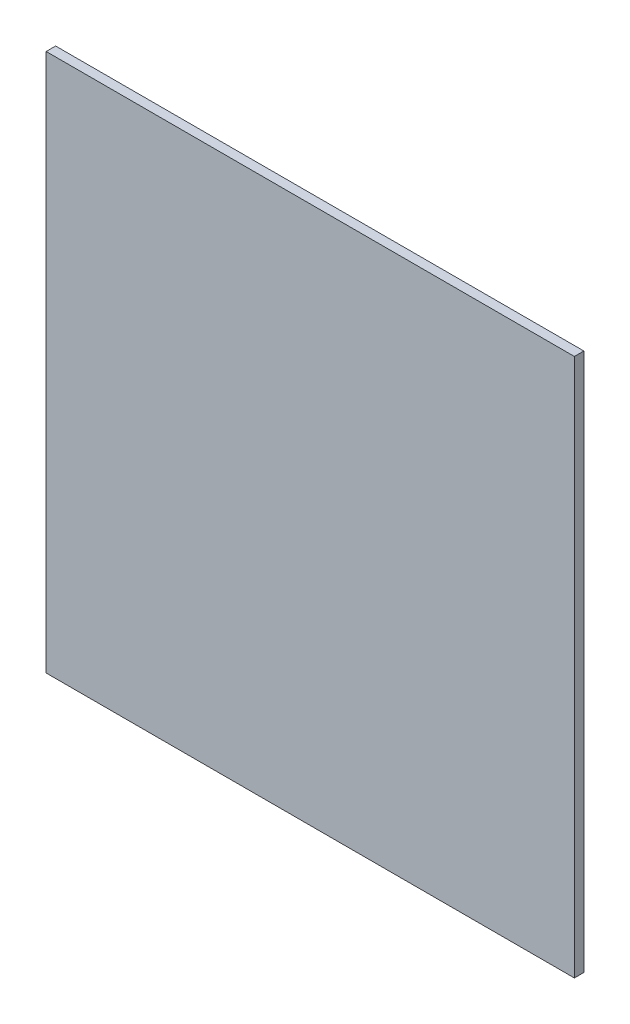
ISO-10303-21;
HEADER;
FILE_DESCRIPTION(('STEP AP214'),'2;1');
FILE_NAME('part.step','',(''),(''),'','','');
FILE_SCHEMA(('AUTOMOTIVE_DESIGN { 1 0 10303 214 1 1 1 1 }'));
ENDSEC;
DATA;
#1=APPLICATION_CONTEXT('core data for automotive mechanical design processes');
#2=APPLICATION_PROTOCOL_DEFINITION('international standard','automotive_design',2000,#1);
#3=PRODUCT_CONTEXT('',#1,'mechanical');
#4=PRODUCT('Part','Part','',(#3));
#5=PRODUCT_RELATED_PRODUCT_CATEGORY('part','',(#4));
#6=PRODUCT_DEFINITION_FORMATION('','',#4);
#7=PRODUCT_DEFINITION_CONTEXT('part definition',#1,'design');
#8=PRODUCT_DEFINITION('design','',#6,#7);
#9=PRODUCT_DEFINITION_SHAPE('','',#8);
#10=(LENGTH_UNIT() NAMED_UNIT(*) SI_UNIT(.MILLI.,.METRE.));
#11=(NAMED_UNIT(*) PLANE_ANGLE_UNIT() SI_UNIT($,.RADIAN.));
#12=(NAMED_UNIT(*) SI_UNIT($,.STERADIAN.) SOLID_ANGLE_UNIT());
#13=UNCERTAINTY_MEASURE_WITH_UNIT(LENGTH_MEASURE(1.E-05),#10,'distance_accuracy_value','');
#14=(GEOMETRIC_REPRESENTATION_CONTEXT(3) GLOBAL_UNCERTAINTY_ASSIGNED_CONTEXT((#13)) GLOBAL_UNIT_ASSIGNED_CONTEXT((#10,
#11,#12)) REPRESENTATION_CONTEXT('',''));
#15=CARTESIAN_POINT('',(0.,0.,0.));
#16=DIRECTION('',(0.,0.,1.));
#17=DIRECTION('',(1.,0.,0.));
#18=AXIS2_PLACEMENT_3D('',#15,#16,#17);
#19=CARTESIAN_POINT('',(-0.2755,0.2225,0.));
#20=DIRECTION('',(0.,0.,1.));
#21=DIRECTION('',(1.,0.,0.));
#22=AXIS2_PLACEMENT_3D('',#19,#20,#21);
#23=PLANE('',#22);
#24=DIRECTION('',(-1.,0.,0.));
#25=VECTOR('',#24,1.);
#26=CARTESIAN_POINT('',(2.51,3.061,0.));
#27=LINE('',#26,#25);
#28=CARTESIAN_POINT('',(2.51,3.061,0.));
#29=VERTEX_POINT('',#28);
#30=CARTESIAN_POINT('',(-3.061,3.061,0.));
#31=VERTEX_POINT('',#30);
#32=EDGE_CURVE('E79',#29,#31,#27,.T.);
#33=ORIENTED_EDGE('',*,*,#32,.F.);
#34=DIRECTION('',(0.,1.,0.));
#35=VECTOR('',#34,1.);
#36=CARTESIAN_POINT('',(2.51,-2.616,0.));
#37=LINE('',#36,#35);
#38=CARTESIAN_POINT('',(2.51,-2.616,0.));
#39=VERTEX_POINT('',#38);
#40=EDGE_CURVE('E55',#39,#29,#37,.T.);
#41=ORIENTED_EDGE('',*,*,#40,.F.);
#42=DIRECTION('',(1.,0.,0.));
#43=VECTOR('',#42,1.);
#44=CARTESIAN_POINT('',(-3.061,-2.616,0.));
#45=LINE('',#44,#43);
#46=CARTESIAN_POINT('',(-3.061,-2.616,0.));
#47=VERTEX_POINT('',#46);
#48=EDGE_CURVE('E57',#47,#39,#45,.T.);
#49=ORIENTED_EDGE('',*,*,#48,.F.);
#50=DIRECTION('',(0.,-1.,0.));
#51=VECTOR('',#50,1.);
#52=CARTESIAN_POINT('',(-3.061,3.061,0.));
#53=LINE('',#52,#51);
#54=EDGE_CURVE('E20',#31,#47,#53,.T.);
#55=ORIENTED_EDGE('',*,*,#54,.F.);
#56=EDGE_LOOP('',(#33,#41,#49,#55));
#57=FACE_BOUND('',#56,.T.);
#58=ADVANCED_FACE('F17',(#57),#23,.F.);
#59=CARTESIAN_POINT('',(-3.061,3.061,0.));
#60=DIRECTION('',(-1.,0.,0.));
#61=DIRECTION('',(0.,-1.,0.));
#62=AXIS2_PLACEMENT_3D('',#59,#60,#61);
#63=PLANE('',#62);
#64=DIRECTION('',(0.,1.,0.));
#65=VECTOR('',#64,1.);
#66=CARTESIAN_POINT('',(-3.061,0.2225,0.1));
#67=LINE('',#66,#65);
#68=CARTESIAN_POINT('',(-3.061,3.061,0.1));
#69=VERTEX_POINT('',#68);
#70=CARTESIAN_POINT('',(-3.061,-2.616,0.1));
#71=VERTEX_POINT('',#70);
#72=EDGE_CURVE('E83',#69,#71,#67,.F.);
#73=ORIENTED_EDGE('',*,*,#72,.F.);
#74=DIRECTION('',(0.,0.,1.));
#75=VECTOR('',#74,1.);
#76=CARTESIAN_POINT('',(-3.061,3.061,0.));
#77=LINE('',#76,#75);
#78=EDGE_CURVE('E68',#31,#69,#77,.T.);
#79=ORIENTED_EDGE('',*,*,#78,.F.);
#80=ORIENTED_EDGE('',*,*,#54,.T.);
#81=DIRECTION('',(0.,0.,-1.));
#82=VECTOR('',#81,1.);
#83=CARTESIAN_POINT('',(-3.061,-2.616,0.));
#84=LINE('',#83,#82);
#85=EDGE_CURVE('E63',#71,#47,#84,.T.);
#86=ORIENTED_EDGE('',*,*,#85,.F.);
#87=EDGE_LOOP('',(#73,#79,#80,#86));
#88=FACE_BOUND('',#87,.T.);
#89=ADVANCED_FACE('F65',(#88),#63,.T.);
#90=CARTESIAN_POINT('',(-3.061,-2.616,0.));
#91=DIRECTION('',(0.,-1.,0.));
#92=DIRECTION('',(0.,0.,-1.));
#93=AXIS2_PLACEMENT_3D('',#90,#91,#92);
#94=PLANE('',#93);
#95=DIRECTION('',(1.,0.,0.));
#96=VECTOR('',#95,1.);
#97=CARTESIAN_POINT('',(-0.2755,-2.616,0.1));
#98=LINE('',#97,#96);
#99=CARTESIAN_POINT('',(2.51,-2.616,0.1));
#100=VERTEX_POINT('',#99);
#101=EDGE_CURVE('E72',#71,#100,#98,.T.);
#102=ORIENTED_EDGE('',*,*,#101,.F.);
#103=ORIENTED_EDGE('',*,*,#85,.T.);
#104=ORIENTED_EDGE('',*,*,#48,.T.);
#105=DIRECTION('',(0.,0.,1.));
#106=VECTOR('',#105,1.);
#107=CARTESIAN_POINT('',(2.51,-2.616,0.));
#108=LINE('',#107,#106);
#109=EDGE_CURVE('E75',#100,#39,#108,.F.);
#110=ORIENTED_EDGE('',*,*,#109,.F.);
#111=EDGE_LOOP('',(#102,#103,#104,#110));
#112=FACE_BOUND('',#111,.T.);
#113=ADVANCED_FACE('F70',(#112),#94,.T.);
#114=CARTESIAN_POINT('',(2.51,-2.616,0.));
#115=DIRECTION('',(1.,0.,0.));
#116=DIRECTION('',(0.,1.,0.));
#117=AXIS2_PLACEMENT_3D('',#114,#115,#116);
#118=PLANE('',#117);
#119=DIRECTION('',(0.,1.,0.));
#120=VECTOR('',#119,1.);
#121=CARTESIAN_POINT('',(2.51,0.2225,0.1));
#122=LINE('',#121,#120);
#123=CARTESIAN_POINT('',(2.51,3.061,0.1));
#124=VERTEX_POINT('',#123);
#125=EDGE_CURVE('E26',#100,#124,#122,.T.);
#126=ORIENTED_EDGE('',*,*,#125,.F.);
#127=ORIENTED_EDGE('',*,*,#109,.T.);
#128=ORIENTED_EDGE('',*,*,#40,.T.);
#129=DIRECTION('',(0.,0.,1.));
#130=VECTOR('',#129,1.);
#131=CARTESIAN_POINT('',(2.51,3.061,0.));
#132=LINE('',#131,#130);
#133=EDGE_CURVE('E35',#124,#29,#132,.F.);
#134=ORIENTED_EDGE('',*,*,#133,.F.);
#135=EDGE_LOOP('',(#126,#127,#128,#134));
#136=FACE_BOUND('',#135,.T.);
#137=ADVANCED_FACE('F89',(#136),#118,.T.);
#138=CARTESIAN_POINT('',(2.51,3.061,0.));
#139=DIRECTION('',(0.,1.,0.));
#140=DIRECTION('',(-1.,0.,0.));
#141=AXIS2_PLACEMENT_3D('',#138,#139,#140);
#142=PLANE('',#141);
#143=DIRECTION('',(1.,0.,0.));
#144=VECTOR('',#143,1.);
#145=CARTESIAN_POINT('',(-0.2755,3.061,0.1));
#146=LINE('',#145,#144);
#147=EDGE_CURVE('E11',#124,#69,#146,.F.);
#148=ORIENTED_EDGE('',*,*,#147,.F.);
#149=ORIENTED_EDGE('',*,*,#133,.T.);
#150=ORIENTED_EDGE('',*,*,#32,.T.);
#151=ORIENTED_EDGE('',*,*,#78,.T.);
#152=EDGE_LOOP('',(#148,#149,#150,#151));
#153=FACE_BOUND('',#152,.T.);
#154=ADVANCED_FACE('F91',(#153),#142,.T.);
#155=CARTESIAN_POINT('',(-0.2755,0.2225,0.1));
#156=DIRECTION('',(0.,0.,1.));
#157=DIRECTION('',(1.,0.,0.));
#158=AXIS2_PLACEMENT_3D('',#155,#156,#157);
#159=PLANE('',#158);
#160=ORIENTED_EDGE('',*,*,#125,.T.);
#161=ORIENTED_EDGE('',*,*,#147,.T.);
#162=ORIENTED_EDGE('',*,*,#72,.T.);
#163=ORIENTED_EDGE('',*,*,#101,.T.);
#164=EDGE_LOOP('',(#160,#161,#162,#163));
#165=FACE_BOUND('',#164,.T.);
#166=ADVANCED_FACE('F88',(#165),#159,.T.);
#167=CLOSED_SHELL('',(#58,#89,#113,#137,#154,#166));
#168=MANIFOLD_SOLID_BREP('B1',#167);
#169=ADVANCED_BREP_SHAPE_REPRESENTATION('',(#18,#168),#14);
#170=SHAPE_DEFINITION_REPRESENTATION(#9,#169);
ENDSEC;
END-ISO-10303-21;
